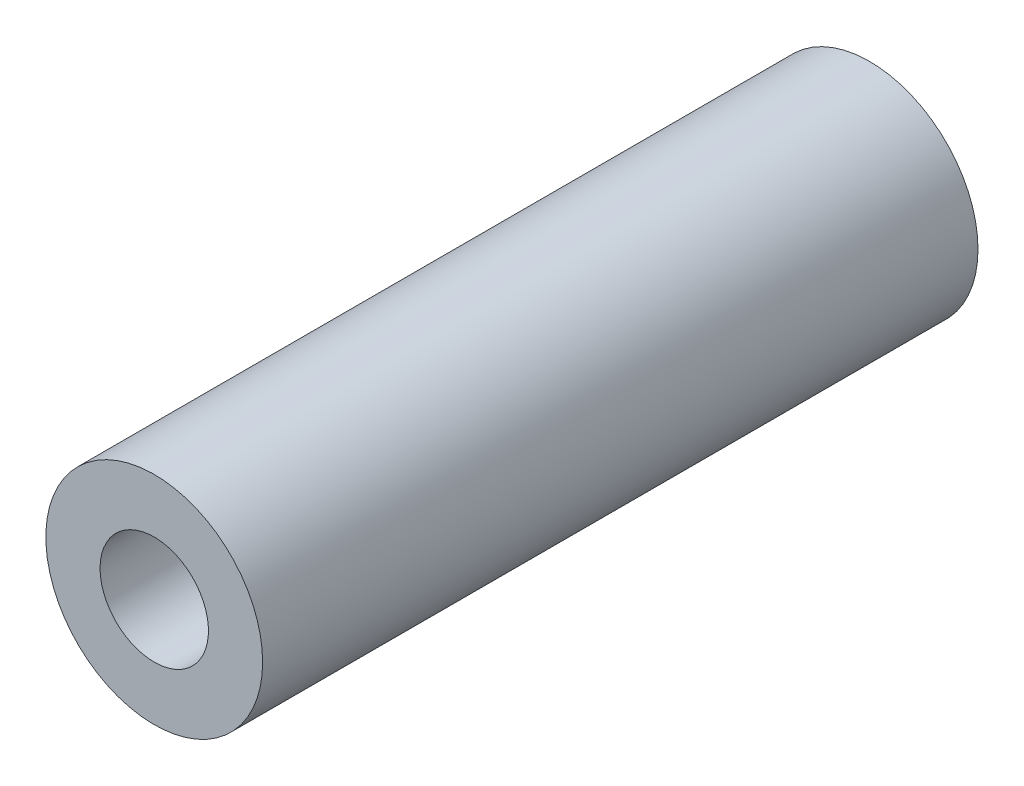
ISO-10303-21;
HEADER;
FILE_DESCRIPTION(('STEP AP214'),'2;1');
FILE_NAME('part.step','',(''),(''),'','','');
FILE_SCHEMA(('AUTOMOTIVE_DESIGN { 1 0 10303 214 1 1 1 1 }'));
ENDSEC;
DATA;
#1=APPLICATION_CONTEXT('core data for automotive mechanical design processes');
#2=APPLICATION_PROTOCOL_DEFINITION('international standard','automotive_design',2000,#1);
#3=PRODUCT_CONTEXT('',#1,'mechanical');
#4=PRODUCT('Part','Part','',(#3));
#5=PRODUCT_RELATED_PRODUCT_CATEGORY('part','',(#4));
#6=PRODUCT_DEFINITION_FORMATION('','',#4);
#7=PRODUCT_DEFINITION_CONTEXT('part definition',#1,'design');
#8=PRODUCT_DEFINITION('design','',#6,#7);
#9=PRODUCT_DEFINITION_SHAPE('','',#8);
#10=(LENGTH_UNIT() NAMED_UNIT(*) SI_UNIT(.MILLI.,.METRE.));
#11=(NAMED_UNIT(*) PLANE_ANGLE_UNIT() SI_UNIT($,.RADIAN.));
#12=(NAMED_UNIT(*) SI_UNIT($,.STERADIAN.) SOLID_ANGLE_UNIT());
#13=UNCERTAINTY_MEASURE_WITH_UNIT(LENGTH_MEASURE(1.E-05),#10,'distance_accuracy_value','');
#14=(GEOMETRIC_REPRESENTATION_CONTEXT(3) GLOBAL_UNCERTAINTY_ASSIGNED_CONTEXT((#13)) GLOBAL_UNIT_ASSIGNED_CONTEXT((#10,
#11,#12)) REPRESENTATION_CONTEXT('',''));
#15=CARTESIAN_POINT('',(0.,0.,0.));
#16=DIRECTION('',(0.,0.,1.));
#17=DIRECTION('',(1.,0.,0.));
#18=AXIS2_PLACEMENT_3D('',#15,#16,#17);
#19=CARTESIAN_POINT('',(0.,0.,33.));
#20=DIRECTION('',(0.,0.,-1.));
#21=DIRECTION('',(-1.,0.,0.));
#22=AXIS2_PLACEMENT_3D('',#19,#20,#21);
#23=CYLINDRICAL_SURFACE('',#22,5.);
#24=CARTESIAN_POINT('',(0.,0.,33.));
#25=DIRECTION('',(0.,0.,1.));
#26=DIRECTION('',(1.,0.,0.));
#27=AXIS2_PLACEMENT_3D('',#24,#25,#26);
#28=CIRCLE('',#27,5.);
#29=CARTESIAN_POINT('',(5.,0.,33.));
#30=VERTEX_POINT('',#29);
#31=EDGE_CURVE('E10',#30,#30,#28,.T.);
#32=ORIENTED_EDGE('',*,*,#31,.F.);
#33=EDGE_LOOP('',(#32));
#34=FACE_BOUND('',#33,.T.);
#35=CARTESIAN_POINT('',(0.,0.,0.));
#36=DIRECTION('',(0.,0.,1.));
#37=DIRECTION('',(1.,0.,0.));
#38=AXIS2_PLACEMENT_3D('',#35,#36,#37);
#39=CIRCLE('',#38,5.);
#40=CARTESIAN_POINT('',(5.,0.,0.));
#41=VERTEX_POINT('',#40);
#42=EDGE_CURVE('E40',#41,#41,#39,.T.);
#43=ORIENTED_EDGE('',*,*,#42,.T.);
#44=EDGE_LOOP('',(#43));
#45=FACE_BOUND('',#44,.T.);
#46=ADVANCED_FACE('F37',(#34,#45),#23,.T.);
#47=CARTESIAN_POINT('',(0.,0.,33.));
#48=DIRECTION('',(0.,0.,1.));
#49=DIRECTION('',(1.,0.,0.));
#50=AXIS2_PLACEMENT_3D('',#47,#48,#49);
#51=PLANE('',#50);
#52=CARTESIAN_POINT('',(0.,0.,33.));
#53=DIRECTION('',(0.,0.,-1.));
#54=DIRECTION('',(-1.,0.,0.));
#55=AXIS2_PLACEMENT_3D('',#52,#53,#54);
#56=CIRCLE('',#55,2.5);
#57=CARTESIAN_POINT('',(-2.5,0.,33.));
#58=VERTEX_POINT('',#57);
#59=EDGE_CURVE('E49',#58,#58,#56,.T.);
#60=ORIENTED_EDGE('',*,*,#59,.T.);
#61=EDGE_LOOP('',(#60));
#62=FACE_BOUND('',#61,.T.);
#63=ORIENTED_EDGE('',*,*,#31,.T.);
#64=EDGE_LOOP('',(#63));
#65=FACE_BOUND('',#64,.T.);
#66=ADVANCED_FACE('F59',(#62,#65),#51,.T.);
#67=CARTESIAN_POINT('',(0.,0.,0.));
#68=DIRECTION('',(0.,0.,1.));
#69=DIRECTION('',(1.,0.,0.));
#70=AXIS2_PLACEMENT_3D('',#67,#68,#69);
#71=PLANE('',#70);
#72=CARTESIAN_POINT('',(0.,0.,0.));
#73=DIRECTION('',(0.,0.,-1.));
#74=DIRECTION('',(-1.,0.,0.));
#75=AXIS2_PLACEMENT_3D('',#72,#73,#74);
#76=CIRCLE('',#75,2.5);
#77=CARTESIAN_POINT('',(-2.5,0.,0.));
#78=VERTEX_POINT('',#77);
#79=EDGE_CURVE('E51',#78,#78,#76,.T.);
#80=ORIENTED_EDGE('',*,*,#79,.F.);
#81=EDGE_LOOP('',(#80));
#82=FACE_BOUND('',#81,.T.);
#83=ORIENTED_EDGE('',*,*,#42,.F.);
#84=EDGE_LOOP('',(#83));
#85=FACE_BOUND('',#84,.T.);
#86=ADVANCED_FACE('F64',(#82,#85),#71,.F.);
#87=CARTESIAN_POINT('',(0.,0.,33.));
#88=DIRECTION('',(0.,0.,-1.));
#89=DIRECTION('',(-1.,0.,0.));
#90=AXIS2_PLACEMENT_3D('',#87,#88,#89);
#91=CYLINDRICAL_SURFACE('',#90,2.5);
#92=ORIENTED_EDGE('',*,*,#59,.F.);
#93=EDGE_LOOP('',(#92));
#94=FACE_BOUND('',#93,.T.);
#95=ORIENTED_EDGE('',*,*,#79,.T.);
#96=EDGE_LOOP('',(#95));
#97=FACE_BOUND('',#96,.T.);
#98=ADVANCED_FACE('F61',(#94,#97),#91,.F.);
#99=CLOSED_SHELL('',(#46,#66,#86,#98));
#100=MANIFOLD_SOLID_BREP('B2',#99);
#101=ADVANCED_BREP_SHAPE_REPRESENTATION('',(#18,#100),#14);
#102=SHAPE_DEFINITION_REPRESENTATION(#9,#101);
ENDSEC;
END-ISO-10303-21;
